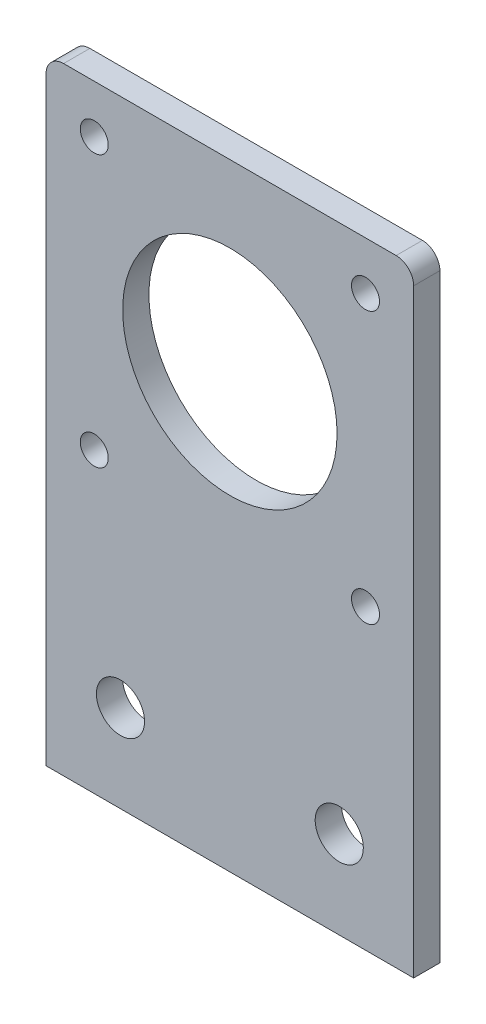
ISO-10303-21;
HEADER;
FILE_DESCRIPTION(('STEP AP214'),'2;1');
FILE_NAME('part.step','',(''),(''),'','','');
FILE_SCHEMA(('AUTOMOTIVE_DESIGN { 1 0 10303 214 1 1 1 1 }'));
ENDSEC;
DATA;
#1=APPLICATION_CONTEXT('core data for automotive mechanical design processes');
#2=APPLICATION_PROTOCOL_DEFINITION('international standard','automotive_design',2000,#1);
#3=PRODUCT_CONTEXT('',#1,'mechanical');
#4=PRODUCT('Part','Part','',(#3));
#5=PRODUCT_RELATED_PRODUCT_CATEGORY('part','',(#4));
#6=PRODUCT_DEFINITION_FORMATION('','',#4);
#7=PRODUCT_DEFINITION_CONTEXT('part definition',#1,'design');
#8=PRODUCT_DEFINITION('design','',#6,#7);
#9=PRODUCT_DEFINITION_SHAPE('','',#8);
#10=(LENGTH_UNIT() NAMED_UNIT(*) SI_UNIT(.MILLI.,.METRE.));
#11=(NAMED_UNIT(*) PLANE_ANGLE_UNIT() SI_UNIT($,.RADIAN.));
#12=(NAMED_UNIT(*) SI_UNIT($,.STERADIAN.) SOLID_ANGLE_UNIT());
#13=UNCERTAINTY_MEASURE_WITH_UNIT(LENGTH_MEASURE(1.E-05),#10,'distance_accuracy_value','');
#14=(GEOMETRIC_REPRESENTATION_CONTEXT(3) GLOBAL_UNCERTAINTY_ASSIGNED_CONTEXT((#13)) GLOBAL_UNIT_ASSIGNED_CONTEXT((#10,
#11,#12)) REPRESENTATION_CONTEXT('',''));
#15=CARTESIAN_POINT('',(0.,0.,0.));
#16=DIRECTION('',(0.,0.,1.));
#17=DIRECTION('',(1.,0.,0.));
#18=AXIS2_PLACEMENT_3D('',#15,#16,#17);
#19=CARTESIAN_POINT('',(0.,0.,1.5));
#20=DIRECTION('',(0.,0.,1.));
#21=DIRECTION('',(1.,0.,0.));
#22=AXIS2_PLACEMENT_3D('',#19,#20,#21);
#23=PLANE('',#22);
#24=DIRECTION('',(-1.,0.,0.));
#25=VECTOR('',#24,1.);
#26=CARTESIAN_POINT('',(-21.,-49.5,1.5));
#27=LINE('',#26,#25);
#28=CARTESIAN_POINT('',(21.,-49.5,1.5));
#29=VERTEX_POINT('',#28);
#30=CARTESIAN_POINT('',(-21.,-49.5,1.5));
#31=VERTEX_POINT('',#30);
#32=EDGE_CURVE('E99',#29,#31,#27,.T.);
#33=ORIENTED_EDGE('',*,*,#32,.F.);
#34=DIRECTION('',(0.,1.,0.));
#35=VECTOR('',#34,1.);
#36=CARTESIAN_POINT('',(21.,21.,1.5));
#37=LINE('',#36,#35);
#38=CARTESIAN_POINT('',(21.,19.,1.5));
#39=VERTEX_POINT('',#38);
#40=EDGE_CURVE('E110',#29,#39,#37,.T.);
#41=ORIENTED_EDGE('',*,*,#40,.T.);
#42=CARTESIAN_POINT('',(19.,19.,1.5));
#43=DIRECTION('',(0.,0.,1.));
#44=DIRECTION('',(1.,0.,0.));
#45=AXIS2_PLACEMENT_3D('',#42,#43,#44);
#46=CIRCLE('',#45,2.);
#47=CARTESIAN_POINT('',(19.,21.,1.5));
#48=VERTEX_POINT('',#47);
#49=EDGE_CURVE('E151',#39,#48,#46,.T.);
#50=ORIENTED_EDGE('',*,*,#49,.T.);
#51=DIRECTION('',(-1.,0.,0.));
#52=VECTOR('',#51,1.);
#53=CARTESIAN_POINT('',(-21.,21.,1.5));
#54=LINE('',#53,#52);
#55=CARTESIAN_POINT('',(-19.,21.,1.5));
#56=VERTEX_POINT('',#55);
#57=EDGE_CURVE('E121',#48,#56,#54,.T.);
#58=ORIENTED_EDGE('',*,*,#57,.T.);
#59=CARTESIAN_POINT('',(-19.,19.,1.5));
#60=DIRECTION('',(0.,0.,1.));
#61=DIRECTION('',(1.,0.,0.));
#62=AXIS2_PLACEMENT_3D('',#59,#60,#61);
#63=CIRCLE('',#62,2.);
#64=CARTESIAN_POINT('',(-21.,19.,1.5));
#65=VERTEX_POINT('',#64);
#66=EDGE_CURVE('E154',#56,#65,#63,.T.);
#67=ORIENTED_EDGE('',*,*,#66,.T.);
#68=DIRECTION('',(0.,-1.,0.));
#69=VECTOR('',#68,1.);
#70=CARTESIAN_POINT('',(-21.,21.,1.5));
#71=LINE('',#70,#69);
#72=EDGE_CURVE('E113',#65,#31,#71,.T.);
#73=ORIENTED_EDGE('',*,*,#72,.T.);
#74=EDGE_LOOP('',(#33,#41,#50,#58,#67,#73));
#75=FACE_BOUND('',#74,.T.);
#76=CARTESIAN_POINT('',(12.5,-39.5,1.5));
#77=DIRECTION('',(0.,0.,1.));
#78=DIRECTION('',(1.,0.,0.));
#79=AXIS2_PLACEMENT_3D('',#76,#77,#78);
#80=CIRCLE('',#79,2.75);
#81=CARTESIAN_POINT('',(15.25,-39.5,1.5));
#82=VERTEX_POINT('',#81);
#83=EDGE_CURVE('E185',#82,#82,#80,.T.);
#84=ORIENTED_EDGE('',*,*,#83,.F.);
#85=EDGE_LOOP('',(#84));
#86=FACE_BOUND('',#85,.T.);
#87=CARTESIAN_POINT('',(-12.5,-39.5,1.5));
#88=DIRECTION('',(0.,0.,1.));
#89=DIRECTION('',(-1.,0.,0.));
#90=AXIS2_PLACEMENT_3D('',#87,#88,#89);
#91=CIRCLE('',#90,2.75);
#92=CARTESIAN_POINT('',(-15.25,-39.5,1.5));
#93=VERTEX_POINT('',#92);
#94=EDGE_CURVE('E189',#93,#93,#91,.T.);
#95=ORIENTED_EDGE('',*,*,#94,.F.);
#96=EDGE_LOOP('',(#95));
#97=FACE_BOUND('',#96,.T.);
#98=CARTESIAN_POINT('',(15.5,15.5,1.5));
#99=DIRECTION('',(0.,0.,1.));
#100=DIRECTION('',(1.,0.,0.));
#101=AXIS2_PLACEMENT_3D('',#98,#99,#100);
#102=CIRCLE('',#101,1.6);
#103=CARTESIAN_POINT('',(17.1,15.5,1.5));
#104=VERTEX_POINT('',#103);
#105=EDGE_CURVE('E196',#104,#104,#102,.T.);
#106=ORIENTED_EDGE('',*,*,#105,.F.);
#107=EDGE_LOOP('',(#106));
#108=FACE_BOUND('',#107,.T.);
#109=CARTESIAN_POINT('',(-15.5,-15.5,1.5));
#110=DIRECTION('',(0.,0.,1.));
#111=DIRECTION('',(1.,0.,0.));
#112=AXIS2_PLACEMENT_3D('',#109,#110,#111);
#113=CIRCLE('',#112,1.6);
#114=CARTESIAN_POINT('',(-13.9,-15.5,1.5));
#115=VERTEX_POINT('',#114);
#116=EDGE_CURVE('E212',#115,#115,#113,.T.);
#117=ORIENTED_EDGE('',*,*,#116,.F.);
#118=EDGE_LOOP('',(#117));
#119=FACE_BOUND('',#118,.T.);
#120=CARTESIAN_POINT('',(0.,0.,1.5));
#121=DIRECTION('',(0.,0.,1.));
#122=DIRECTION('',(1.,0.,0.));
#123=AXIS2_PLACEMENT_3D('',#120,#121,#122);
#124=CIRCLE('',#123,12.25);
#125=CARTESIAN_POINT('',(12.25,0.,1.5));
#126=VERTEX_POINT('',#125);
#127=EDGE_CURVE('E136',#126,#126,#124,.T.);
#128=ORIENTED_EDGE('',*,*,#127,.F.);
#129=EDGE_LOOP('',(#128));
#130=FACE_BOUND('',#129,.T.);
#131=CARTESIAN_POINT('',(15.5,-15.5,1.5));
#132=DIRECTION('',(0.,0.,1.));
#133=DIRECTION('',(1.,0.,0.));
#134=AXIS2_PLACEMENT_3D('',#131,#132,#133);
#135=CIRCLE('',#134,1.6);
#136=CARTESIAN_POINT('',(17.1,-15.5,1.5));
#137=VERTEX_POINT('',#136);
#138=EDGE_CURVE('E220',#137,#137,#135,.T.);
#139=ORIENTED_EDGE('',*,*,#138,.F.);
#140=EDGE_LOOP('',(#139));
#141=FACE_BOUND('',#140,.T.);
#142=CARTESIAN_POINT('',(-15.5,15.5,1.5));
#143=DIRECTION('',(0.,0.,1.));
#144=DIRECTION('',(1.,0.,0.));
#145=AXIS2_PLACEMENT_3D('',#142,#143,#144);
#146=CIRCLE('',#145,1.6);
#147=CARTESIAN_POINT('',(-13.9,15.5,1.5));
#148=VERTEX_POINT('',#147);
#149=EDGE_CURVE('E204',#148,#148,#146,.T.);
#150=ORIENTED_EDGE('',*,*,#149,.F.);
#151=EDGE_LOOP('',(#150));
#152=FACE_BOUND('',#151,.T.);
#153=ADVANCED_FACE('F45',(#75,#86,#97,#108,#119,#130,#141,#152),#23,.T.);
#154=CARTESIAN_POINT('',(0.,0.,-1.5));
#155=DIRECTION('',(0.,0.,1.));
#156=DIRECTION('',(1.,0.,0.));
#157=AXIS2_PLACEMENT_3D('',#154,#155,#156);
#158=PLANE('',#157);
#159=CARTESIAN_POINT('',(12.5,-39.5,-1.5));
#160=DIRECTION('',(0.,0.,1.));
#161=DIRECTION('',(1.,0.,0.));
#162=AXIS2_PLACEMENT_3D('',#159,#160,#161);
#163=CIRCLE('',#162,2.75);
#164=CARTESIAN_POINT('',(15.25,-39.5,-1.5));
#165=VERTEX_POINT('',#164);
#166=EDGE_CURVE('E180',#165,#165,#163,.T.);
#167=ORIENTED_EDGE('',*,*,#166,.T.);
#168=EDGE_LOOP('',(#167));
#169=FACE_BOUND('',#168,.T.);
#170=CARTESIAN_POINT('',(-12.5,-39.5,-1.5));
#171=DIRECTION('',(0.,0.,1.));
#172=DIRECTION('',(-1.,0.,0.));
#173=AXIS2_PLACEMENT_3D('',#170,#171,#172);
#174=CIRCLE('',#173,2.75);
#175=CARTESIAN_POINT('',(-15.25,-39.5,-1.5));
#176=VERTEX_POINT('',#175);
#177=EDGE_CURVE('E177',#176,#176,#174,.T.);
#178=ORIENTED_EDGE('',*,*,#177,.T.);
#179=EDGE_LOOP('',(#178));
#180=FACE_BOUND('',#179,.T.);
#181=DIRECTION('',(0.,1.,0.));
#182=VECTOR('',#181,1.);
#183=CARTESIAN_POINT('',(21.,21.,-1.5));
#184=LINE('',#183,#182);
#185=CARTESIAN_POINT('',(21.,-49.5,-1.5));
#186=VERTEX_POINT('',#185);
#187=CARTESIAN_POINT('',(21.,19.,-1.5));
#188=VERTEX_POINT('',#187);
#189=EDGE_CURVE('E135',#186,#188,#184,.T.);
#190=ORIENTED_EDGE('',*,*,#189,.F.);
#191=DIRECTION('',(-1.,0.,0.));
#192=VECTOR('',#191,1.);
#193=CARTESIAN_POINT('',(0.,-49.5,-1.5));
#194=LINE('',#193,#192);
#195=CARTESIAN_POINT('',(-21.,-49.5,-1.5));
#196=VERTEX_POINT('',#195);
#197=EDGE_CURVE('E61',#186,#196,#194,.T.);
#198=ORIENTED_EDGE('',*,*,#197,.T.);
#199=DIRECTION('',(0.,-1.,0.));
#200=VECTOR('',#199,1.);
#201=CARTESIAN_POINT('',(-21.,21.,-1.5));
#202=LINE('',#201,#200);
#203=CARTESIAN_POINT('',(-21.,19.,-1.5));
#204=VERTEX_POINT('',#203);
#205=EDGE_CURVE('E131',#204,#196,#202,.T.);
#206=ORIENTED_EDGE('',*,*,#205,.F.);
#207=CARTESIAN_POINT('',(-19.,19.,-1.5));
#208=DIRECTION('',(0.,0.,1.));
#209=DIRECTION('',(1.,0.,0.));
#210=AXIS2_PLACEMENT_3D('',#207,#208,#209);
#211=CIRCLE('',#210,2.);
#212=CARTESIAN_POINT('',(-19.,21.,-1.5));
#213=VERTEX_POINT('',#212);
#214=EDGE_CURVE('E144',#204,#213,#211,.F.);
#215=ORIENTED_EDGE('',*,*,#214,.T.);
#216=DIRECTION('',(-1.,0.,0.));
#217=VECTOR('',#216,1.);
#218=CARTESIAN_POINT('',(-21.,21.,-1.5));
#219=LINE('',#218,#217);
#220=CARTESIAN_POINT('',(19.,21.,-1.5));
#221=VERTEX_POINT('',#220);
#222=EDGE_CURVE('E127',#221,#213,#219,.T.);
#223=ORIENTED_EDGE('',*,*,#222,.F.);
#224=CARTESIAN_POINT('',(19.,19.,-1.5));
#225=DIRECTION('',(0.,0.,1.));
#226=DIRECTION('',(1.,0.,0.));
#227=AXIS2_PLACEMENT_3D('',#224,#225,#226);
#228=CIRCLE('',#227,2.);
#229=EDGE_CURVE('E125',#221,#188,#228,.F.);
#230=ORIENTED_EDGE('',*,*,#229,.T.);
#231=EDGE_LOOP('',(#190,#198,#206,#215,#223,#230));
#232=FACE_BOUND('',#231,.T.);
#233=CARTESIAN_POINT('',(15.5,15.5,-1.5));
#234=DIRECTION('',(0.,0.,1.));
#235=DIRECTION('',(1.,0.,0.));
#236=AXIS2_PLACEMENT_3D('',#233,#234,#235);
#237=CIRCLE('',#236,1.6);
#238=CARTESIAN_POINT('',(17.1,15.5,-1.5));
#239=VERTEX_POINT('',#238);
#240=EDGE_CURVE('E184',#239,#239,#237,.T.);
#241=ORIENTED_EDGE('',*,*,#240,.T.);
#242=EDGE_LOOP('',(#241));
#243=FACE_BOUND('',#242,.T.);
#244=CARTESIAN_POINT('',(-15.5,15.5,-1.5));
#245=DIRECTION('',(0.,0.,1.));
#246=DIRECTION('',(1.,0.,0.));
#247=AXIS2_PLACEMENT_3D('',#244,#245,#246);
#248=CIRCLE('',#247,1.6);
#249=CARTESIAN_POINT('',(-13.9,15.5,-1.5));
#250=VERTEX_POINT('',#249);
#251=EDGE_CURVE('E200',#250,#250,#248,.T.);
#252=ORIENTED_EDGE('',*,*,#251,.T.);
#253=EDGE_LOOP('',(#252));
#254=FACE_BOUND('',#253,.T.);
#255=CARTESIAN_POINT('',(-15.5,-15.5,-1.5));
#256=DIRECTION('',(0.,0.,1.));
#257=DIRECTION('',(1.,0.,0.));
#258=AXIS2_PLACEMENT_3D('',#255,#256,#257);
#259=CIRCLE('',#258,1.6);
#260=CARTESIAN_POINT('',(-13.9,-15.5,-1.5));
#261=VERTEX_POINT('',#260);
#262=EDGE_CURVE('E208',#261,#261,#259,.T.);
#263=ORIENTED_EDGE('',*,*,#262,.T.);
#264=EDGE_LOOP('',(#263));
#265=FACE_BOUND('',#264,.T.);
#266=CARTESIAN_POINT('',(15.5,-15.5,-1.5));
#267=DIRECTION('',(0.,0.,1.));
#268=DIRECTION('',(1.,0.,0.));
#269=AXIS2_PLACEMENT_3D('',#266,#267,#268);
#270=CIRCLE('',#269,1.6);
#271=CARTESIAN_POINT('',(17.1,-15.5,-1.5));
#272=VERTEX_POINT('',#271);
#273=EDGE_CURVE('E216',#272,#272,#270,.T.);
#274=ORIENTED_EDGE('',*,*,#273,.T.);
#275=EDGE_LOOP('',(#274));
#276=FACE_BOUND('',#275,.T.);
#277=CARTESIAN_POINT('',(0.,0.,-1.5));
#278=DIRECTION('',(0.,0.,1.));
#279=DIRECTION('',(1.,0.,0.));
#280=AXIS2_PLACEMENT_3D('',#277,#278,#279);
#281=CIRCLE('',#280,12.25);
#282=CARTESIAN_POINT('',(12.25,0.,-1.5));
#283=VERTEX_POINT('',#282);
#284=EDGE_CURVE('E224',#283,#283,#281,.T.);
#285=ORIENTED_EDGE('',*,*,#284,.T.);
#286=EDGE_LOOP('',(#285));
#287=FACE_BOUND('',#286,.T.);
#288=ADVANCED_FACE('F165',(#169,#180,#232,#243,#254,#265,#276,#287),#158,.F.);
#289=CARTESIAN_POINT('',(-21.,21.,1.5));
#290=DIRECTION('',(1.,0.,0.));
#291=DIRECTION('',(0.,1.,0.));
#292=AXIS2_PLACEMENT_3D('',#289,#290,#291);
#293=PLANE('',#292);
#294=ORIENTED_EDGE('',*,*,#205,.T.);
#295=DIRECTION('',(0.,0.,1.));
#296=VECTOR('',#295,1.);
#297=CARTESIAN_POINT('',(-21.,-49.5,-8.5));
#298=LINE('',#297,#296);
#299=EDGE_CURVE('E105',#196,#31,#298,.T.);
#300=ORIENTED_EDGE('',*,*,#299,.T.);
#301=ORIENTED_EDGE('',*,*,#72,.F.);
#302=DIRECTION('',(0.,0.,-1.));
#303=VECTOR('',#302,1.);
#304=CARTESIAN_POINT('',(-21.,19.,1.5));
#305=LINE('',#304,#303);
#306=EDGE_CURVE('E147',#65,#204,#305,.T.);
#307=ORIENTED_EDGE('',*,*,#306,.T.);
#308=EDGE_LOOP('',(#294,#300,#301,#307));
#309=FACE_BOUND('',#308,.T.);
#310=ADVANCED_FACE('F173',(#309),#293,.F.);
#311=CARTESIAN_POINT('',(21.,21.,1.5));
#312=DIRECTION('',(-1.,0.,0.));
#313=DIRECTION('',(0.,-1.,0.));
#314=AXIS2_PLACEMENT_3D('',#311,#312,#313);
#315=PLANE('',#314);
#316=ORIENTED_EDGE('',*,*,#40,.F.);
#317=DIRECTION('',(0.,0.,1.));
#318=VECTOR('',#317,1.);
#319=CARTESIAN_POINT('',(21.,-49.5,-8.5));
#320=LINE('',#319,#318);
#321=EDGE_CURVE('E96',#186,#29,#320,.T.);
#322=ORIENTED_EDGE('',*,*,#321,.F.);
#323=ORIENTED_EDGE('',*,*,#189,.T.);
#324=DIRECTION('',(0.,0.,-1.));
#325=VECTOR('',#324,1.);
#326=CARTESIAN_POINT('',(21.,19.,1.5));
#327=LINE('',#326,#325);
#328=EDGE_CURVE('E118',#188,#39,#327,.F.);
#329=ORIENTED_EDGE('',*,*,#328,.T.);
#330=EDGE_LOOP('',(#316,#322,#323,#329));
#331=FACE_BOUND('',#330,.T.);
#332=ADVANCED_FACE('F116',(#331),#315,.F.);
#333=CARTESIAN_POINT('',(-21.,21.,1.5));
#334=DIRECTION('',(0.,-1.,0.));
#335=DIRECTION('',(0.,0.,-1.));
#336=AXIS2_PLACEMENT_3D('',#333,#334,#335);
#337=PLANE('',#336);
#338=ORIENTED_EDGE('',*,*,#222,.T.);
#339=DIRECTION('',(0.,0.,-1.));
#340=VECTOR('',#339,1.);
#341=CARTESIAN_POINT('',(-19.,21.,1.5));
#342=LINE('',#341,#340);
#343=EDGE_CURVE('E11',#213,#56,#342,.F.);
#344=ORIENTED_EDGE('',*,*,#343,.T.);
#345=ORIENTED_EDGE('',*,*,#57,.F.);
#346=DIRECTION('',(0.,0.,-1.));
#347=VECTOR('',#346,1.);
#348=CARTESIAN_POINT('',(19.,21.,1.5));
#349=LINE('',#348,#347);
#350=EDGE_CURVE('E54',#48,#221,#349,.T.);
#351=ORIENTED_EDGE('',*,*,#350,.T.);
#352=EDGE_LOOP('',(#338,#344,#345,#351));
#353=FACE_BOUND('',#352,.T.);
#354=ADVANCED_FACE('F162',(#353),#337,.F.);
#355=CARTESIAN_POINT('',(0.,0.,1.5));
#356=DIRECTION('',(0.,0.,-1.));
#357=DIRECTION('',(-1.,0.,0.));
#358=AXIS2_PLACEMENT_3D('',#355,#356,#357);
#359=CYLINDRICAL_SURFACE('',#358,12.25);
#360=ORIENTED_EDGE('',*,*,#127,.T.);
#361=EDGE_LOOP('',(#360));
#362=FACE_BOUND('',#361,.T.);
#363=ORIENTED_EDGE('',*,*,#284,.F.);
#364=EDGE_LOOP('',(#363));
#365=FACE_BOUND('',#364,.T.);
#366=ADVANCED_FACE('F235',(#362,#365),#359,.F.);
#367=CARTESIAN_POINT('',(15.5,-15.5,1.5));
#368=DIRECTION('',(0.,0.,-1.));
#369=DIRECTION('',(-1.,0.,0.));
#370=AXIS2_PLACEMENT_3D('',#367,#368,#369);
#371=CYLINDRICAL_SURFACE('',#370,1.6);
#372=ORIENTED_EDGE('',*,*,#138,.T.);
#373=EDGE_LOOP('',(#372));
#374=FACE_BOUND('',#373,.T.);
#375=ORIENTED_EDGE('',*,*,#273,.F.);
#376=EDGE_LOOP('',(#375));
#377=FACE_BOUND('',#376,.T.);
#378=ADVANCED_FACE('F237',(#374,#377),#371,.F.);
#379=CARTESIAN_POINT('',(-15.5,-15.5,1.5));
#380=DIRECTION('',(0.,0.,-1.));
#381=DIRECTION('',(-1.,0.,0.));
#382=AXIS2_PLACEMENT_3D('',#379,#380,#381);
#383=CYLINDRICAL_SURFACE('',#382,1.6);
#384=ORIENTED_EDGE('',*,*,#116,.T.);
#385=EDGE_LOOP('',(#384));
#386=FACE_BOUND('',#385,.T.);
#387=ORIENTED_EDGE('',*,*,#262,.F.);
#388=EDGE_LOOP('',(#387));
#389=FACE_BOUND('',#388,.T.);
#390=ADVANCED_FACE('F243',(#386,#389),#383,.F.);
#391=CARTESIAN_POINT('',(-15.5,15.5,1.5));
#392=DIRECTION('',(0.,0.,-1.));
#393=DIRECTION('',(-1.,0.,0.));
#394=AXIS2_PLACEMENT_3D('',#391,#392,#393);
#395=CYLINDRICAL_SURFACE('',#394,1.6);
#396=ORIENTED_EDGE('',*,*,#149,.T.);
#397=EDGE_LOOP('',(#396));
#398=FACE_BOUND('',#397,.T.);
#399=ORIENTED_EDGE('',*,*,#251,.F.);
#400=EDGE_LOOP('',(#399));
#401=FACE_BOUND('',#400,.T.);
#402=ADVANCED_FACE('F267',(#398,#401),#395,.F.);
#403=CARTESIAN_POINT('',(15.5,15.5,1.5));
#404=DIRECTION('',(0.,0.,-1.));
#405=DIRECTION('',(-1.,0.,0.));
#406=AXIS2_PLACEMENT_3D('',#403,#404,#405);
#407=CYLINDRICAL_SURFACE('',#406,1.6);
#408=ORIENTED_EDGE('',*,*,#105,.T.);
#409=EDGE_LOOP('',(#408));
#410=FACE_BOUND('',#409,.T.);
#411=ORIENTED_EDGE('',*,*,#240,.F.);
#412=EDGE_LOOP('',(#411));
#413=FACE_BOUND('',#412,.T.);
#414=ADVANCED_FACE('F261',(#410,#413),#407,.F.);
#415=CARTESIAN_POINT('',(-19.,19.,1.5));
#416=DIRECTION('',(0.,0.,-1.));
#417=DIRECTION('',(-1.,0.,0.));
#418=AXIS2_PLACEMENT_3D('',#415,#416,#417);
#419=CYLINDRICAL_SURFACE('',#418,2.);
#420=ORIENTED_EDGE('',*,*,#66,.F.);
#421=ORIENTED_EDGE('',*,*,#343,.F.);
#422=ORIENTED_EDGE('',*,*,#214,.F.);
#423=ORIENTED_EDGE('',*,*,#306,.F.);
#424=EDGE_LOOP('',(#420,#421,#422,#423));
#425=FACE_BOUND('',#424,.T.);
#426=ADVANCED_FACE('F171',(#425),#419,.T.);
#427=CARTESIAN_POINT('',(19.,19.,1.5));
#428=DIRECTION('',(0.,0.,-1.));
#429=DIRECTION('',(-1.,0.,0.));
#430=AXIS2_PLACEMENT_3D('',#427,#428,#429);
#431=CYLINDRICAL_SURFACE('',#430,2.);
#432=ORIENTED_EDGE('',*,*,#49,.F.);
#433=ORIENTED_EDGE('',*,*,#328,.F.);
#434=ORIENTED_EDGE('',*,*,#229,.F.);
#435=ORIENTED_EDGE('',*,*,#350,.F.);
#436=EDGE_LOOP('',(#432,#433,#434,#435));
#437=FACE_BOUND('',#436,.T.);
#438=ADVANCED_FACE('F47',(#437),#431,.T.);
#439=CARTESIAN_POINT('',(-12.5,-39.5,-1.5));
#440=DIRECTION('',(0.,0.,1.));
#441=DIRECTION('',(1.,0.,0.));
#442=AXIS2_PLACEMENT_3D('',#439,#440,#441);
#443=CYLINDRICAL_SURFACE('',#442,2.75);
#444=ORIENTED_EDGE('',*,*,#177,.F.);
#445=EDGE_LOOP('',(#444));
#446=FACE_BOUND('',#445,.T.);
#447=ORIENTED_EDGE('',*,*,#94,.T.);
#448=EDGE_LOOP('',(#447));
#449=FACE_BOUND('',#448,.T.);
#450=ADVANCED_FACE('F265',(#446,#449),#443,.F.);
#451=CARTESIAN_POINT('',(12.5,-39.5,-1.5));
#452=DIRECTION('',(0.,0.,1.));
#453=DIRECTION('',(1.,0.,0.));
#454=AXIS2_PLACEMENT_3D('',#451,#452,#453);
#455=CYLINDRICAL_SURFACE('',#454,2.75);
#456=ORIENTED_EDGE('',*,*,#166,.F.);
#457=EDGE_LOOP('',(#456));
#458=FACE_BOUND('',#457,.T.);
#459=ORIENTED_EDGE('',*,*,#83,.T.);
#460=EDGE_LOOP('',(#459));
#461=FACE_BOUND('',#460,.T.);
#462=ADVANCED_FACE('F311',(#458,#461),#455,.F.);
#463=CARTESIAN_POINT('',(-21.,-49.5,-8.5));
#464=DIRECTION('',(0.,1.,0.));
#465=DIRECTION('',(0.,0.,1.));
#466=AXIS2_PLACEMENT_3D('',#463,#464,#465);
#467=PLANE('',#466);
#468=ORIENTED_EDGE('',*,*,#321,.T.);
#469=ORIENTED_EDGE('',*,*,#32,.T.);
#470=ORIENTED_EDGE('',*,*,#299,.F.);
#471=ORIENTED_EDGE('',*,*,#197,.F.);
#472=EDGE_LOOP('',(#468,#469,#470,#471));
#473=FACE_BOUND('',#472,.T.);
#474=ADVANCED_FACE('F98',(#473),#467,.F.);
#475=CLOSED_SHELL('',(#153,#288,#310,#332,#354,#366,#378,#390,#402,#414,#426,#438,#450,#462,#474));
#476=MANIFOLD_SOLID_BREP('B2',#475);
#477=ADVANCED_BREP_SHAPE_REPRESENTATION('',(#18,#476),#14);
#478=SHAPE_DEFINITION_REPRESENTATION(#9,#477);
ENDSEC;
END-ISO-10303-21;
